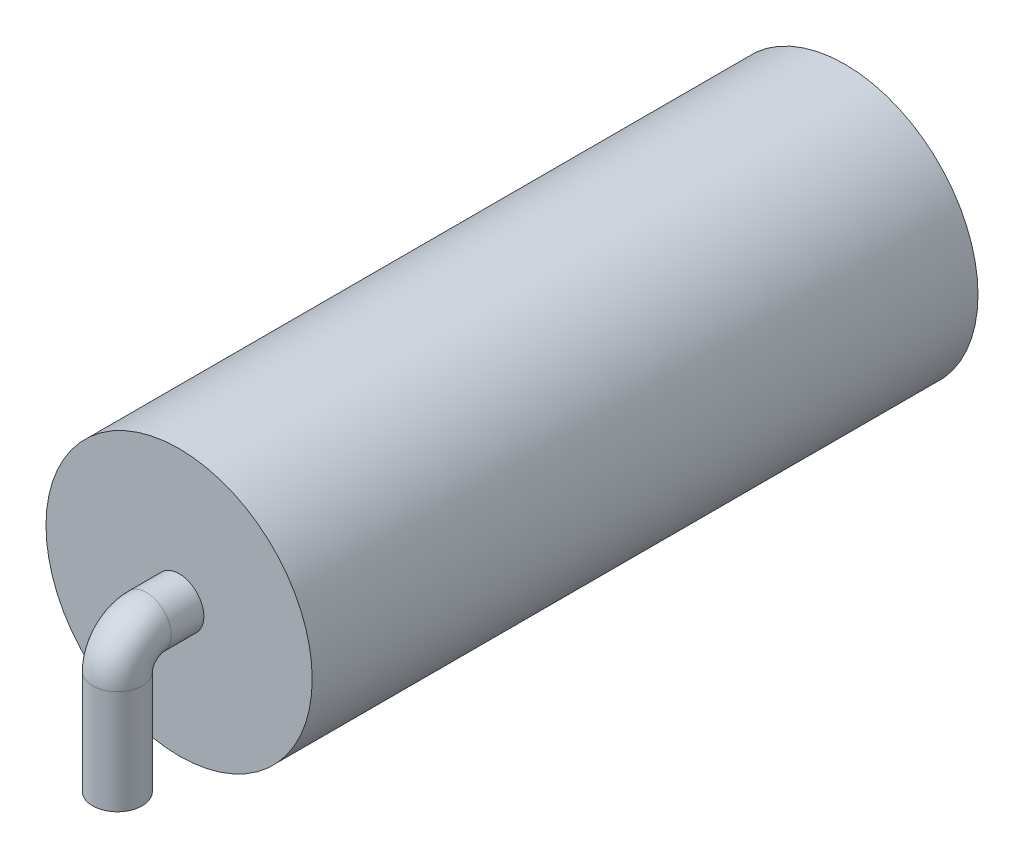
ISO-10303-21;
HEADER;
FILE_DESCRIPTION(('STEP AP214'),'2;1');
FILE_NAME('part.step','',(''),(''),'','','');
FILE_SCHEMA(('AUTOMOTIVE_DESIGN { 1 0 10303 214 1 1 1 1 }'));
ENDSEC;
DATA;
#1=APPLICATION_CONTEXT('core data for automotive mechanical design processes');
#2=APPLICATION_PROTOCOL_DEFINITION('international standard','automotive_design',2000,#1);
#3=PRODUCT_CONTEXT('',#1,'mechanical');
#4=PRODUCT('Part','Part','',(#3));
#5=PRODUCT_RELATED_PRODUCT_CATEGORY('part','',(#4));
#6=PRODUCT_DEFINITION_FORMATION('','',#4);
#7=PRODUCT_DEFINITION_CONTEXT('part definition',#1,'design');
#8=PRODUCT_DEFINITION('design','',#6,#7);
#9=PRODUCT_DEFINITION_SHAPE('','',#8);
#10=(LENGTH_UNIT() NAMED_UNIT(*) SI_UNIT(.MILLI.,.METRE.));
#11=(NAMED_UNIT(*) PLANE_ANGLE_UNIT() SI_UNIT($,.RADIAN.));
#12=(NAMED_UNIT(*) SI_UNIT($,.STERADIAN.) SOLID_ANGLE_UNIT());
#13=UNCERTAINTY_MEASURE_WITH_UNIT(LENGTH_MEASURE(1.E-05),#10,'distance_accuracy_value','');
#14=(GEOMETRIC_REPRESENTATION_CONTEXT(3) GLOBAL_UNCERTAINTY_ASSIGNED_CONTEXT((#13)) GLOBAL_UNIT_ASSIGNED_CONTEXT((#10,
#11,#12)) REPRESENTATION_CONTEXT('',''));
#15=CARTESIAN_POINT('',(0.,0.,0.));
#16=DIRECTION('',(0.,0.,1.));
#17=DIRECTION('',(1.,0.,0.));
#18=AXIS2_PLACEMENT_3D('',#15,#16,#17);
#19=CARTESIAN_POINT('',(0.,0.,5.715));
#20=DIRECTION('',(0.,0.,-1.));
#21=DIRECTION('',(-1.,0.,0.));
#22=AXIS2_PLACEMENT_3D('',#19,#20,#21);
#23=CYLINDRICAL_SURFACE('',#22,2.285);
#24=CARTESIAN_POINT('',(0.,0.,5.715));
#25=DIRECTION('',(0.,0.,1.));
#26=DIRECTION('',(1.,0.,0.));
#27=AXIS2_PLACEMENT_3D('',#24,#25,#26);
#28=CIRCLE('',#27,2.285);
#29=CARTESIAN_POINT('',(2.285,0.,5.715));
#30=VERTEX_POINT('',#29);
#31=EDGE_CURVE('E55',#30,#30,#28,.T.);
#32=ORIENTED_EDGE('',*,*,#31,.F.);
#33=EDGE_LOOP('',(#32));
#34=FACE_BOUND('',#33,.T.);
#35=CARTESIAN_POINT('',(0.,0.,-5.715));
#36=DIRECTION('',(0.,0.,1.));
#37=DIRECTION('',(1.,0.,0.));
#38=AXIS2_PLACEMENT_3D('',#35,#36,#37);
#39=CIRCLE('',#38,2.285);
#40=CARTESIAN_POINT('',(2.285,0.,-5.715));
#41=VERTEX_POINT('',#40);
#42=EDGE_CURVE('E59',#41,#41,#39,.T.);
#43=ORIENTED_EDGE('',*,*,#42,.T.);
#44=EDGE_LOOP('',(#43));
#45=FACE_BOUND('',#44,.T.);
#46=ADVANCED_FACE('F49',(#34,#45),#23,.T.);
#47=CARTESIAN_POINT('',(0.,0.,5.715));
#48=DIRECTION('',(0.,0.,1.));
#49=DIRECTION('',(1.,0.,0.));
#50=AXIS2_PLACEMENT_3D('',#47,#48,#49);
#51=PLANE('',#50);
#52=CARTESIAN_POINT('',(0.,0.,5.715));
#53=DIRECTION('',(0.,0.,1.));
#54=DIRECTION('',(1.,0.,0.));
#55=AXIS2_PLACEMENT_3D('',#52,#53,#54);
#56=CIRCLE('',#55,0.425);
#57=CARTESIAN_POINT('',(0.425,0.,5.715));
#58=VERTEX_POINT('',#57);
#59=EDGE_CURVE('E64',#58,#58,#56,.F.);
#60=ORIENTED_EDGE('',*,*,#59,.T.);
#61=EDGE_LOOP('',(#60));
#62=FACE_BOUND('',#61,.T.);
#63=ORIENTED_EDGE('',*,*,#31,.T.);
#64=EDGE_LOOP('',(#63));
#65=FACE_BOUND('',#64,.T.);
#66=ADVANCED_FACE('F104',(#62,#65),#51,.T.);
#67=CARTESIAN_POINT('',(0.,0.,-5.715));
#68=DIRECTION('',(0.,0.,1.));
#69=DIRECTION('',(1.,0.,0.));
#70=AXIS2_PLACEMENT_3D('',#67,#68,#69);
#71=PLANE('',#70);
#72=CARTESIAN_POINT('',(0.,0.,-5.715));
#73=DIRECTION('',(0.,0.,1.));
#74=DIRECTION('',(1.,0.,0.));
#75=AXIS2_PLACEMENT_3D('',#72,#73,#74);
#76=CIRCLE('',#75,0.425);
#77=CARTESIAN_POINT('',(0.425,0.,-5.715));
#78=VERTEX_POINT('',#77);
#79=EDGE_CURVE('E11',#78,#78,#76,.F.);
#80=ORIENTED_EDGE('',*,*,#79,.F.);
#81=EDGE_LOOP('',(#80));
#82=FACE_BOUND('',#81,.T.);
#83=ORIENTED_EDGE('',*,*,#42,.F.);
#84=EDGE_LOOP('',(#83));
#85=FACE_BOUND('',#84,.T.);
#86=ADVANCED_FACE('F109',(#82,#85),#71,.F.);
#87=CARTESIAN_POINT('',(0.,-2.285,-6.775));
#88=DIRECTION('',(0.,1.,0.));
#89=DIRECTION('',(0.,0.,1.));
#90=AXIS2_PLACEMENT_3D('',#87,#88,#89);
#91=PLANE('',#90);
#92=CARTESIAN_POINT('',(0.,-2.285,-6.775));
#93=DIRECTION('',(0.,1.,0.));
#94=DIRECTION('',(0.,0.,1.));
#95=AXIS2_PLACEMENT_3D('',#92,#93,#94);
#96=CIRCLE('',#95,0.425);
#97=CARTESIAN_POINT('',(0.,-2.285,-6.35));
#98=VERTEX_POINT('',#97);
#99=EDGE_CURVE('E68',#98,#98,#96,.T.);
#100=ORIENTED_EDGE('',*,*,#99,.F.);
#101=EDGE_LOOP('',(#100));
#102=FACE_BOUND('',#101,.T.);
#103=ADVANCED_FACE('F116',(#102),#91,.F.);
#104=CARTESIAN_POINT('',(0.,-0.500000000000001,-6.775));
#105=DIRECTION('',(0.,-1.,0.));
#106=DIRECTION('',(0.,0.,-1.));
#107=AXIS2_PLACEMENT_3D('',#104,#105,#106);
#108=CYLINDRICAL_SURFACE('',#107,0.425);
#109=ORIENTED_EDGE('',*,*,#99,.T.);
#110=EDGE_LOOP('',(#109));
#111=FACE_BOUND('',#110,.T.);
#112=CARTESIAN_POINT('',(0.,-0.499999999999999,-6.775));
#113=DIRECTION('',(0.,1.,0.));
#114=DIRECTION('',(0.,0.,1.));
#115=AXIS2_PLACEMENT_3D('',#112,#113,#114);
#116=CIRCLE('',#115,0.425);
#117=CARTESIAN_POINT('',(0.,-0.499999999999997,-7.2));
#118=VERTEX_POINT('',#117);
#119=EDGE_CURVE('E71',#118,#118,#116,.T.);
#120=ORIENTED_EDGE('',*,*,#119,.F.);
#121=EDGE_LOOP('',(#120));
#122=FACE_BOUND('',#121,.T.);
#123=ADVANCED_FACE('F121',(#111,#122),#108,.T.);
#124=CARTESIAN_POINT('',(0.,-0.500000000000001,-6.275));
#125=DIRECTION('',(-1.,0.,0.));
#126=DIRECTION('',(0.,0.,1.));
#127=AXIS2_PLACEMENT_3D('',#124,#125,#126);
#128=TOROIDAL_SURFACE('',#127,0.499999999999999,0.425);
#129=CARTESIAN_POINT('',(0.,0.,-6.275));
#130=DIRECTION('',(0.,0.,1.));
#131=DIRECTION('',(0.,-1.,0.));
#132=AXIS2_PLACEMENT_3D('',#129,#130,#131);
#133=CIRCLE('',#132,0.425);
#134=CARTESIAN_POINT('',(0.,0.424999999999998,-6.275));
#135=VERTEX_POINT('',#134);
#136=EDGE_CURVE('E74',#135,#135,#133,.T.);
#137=CARTESIAN_POINT('',(0.,-0.500000000000001,-6.275));
#138=DIRECTION('',(-1.,0.,0.));
#139=DIRECTION('',(0.,0.,1.));
#140=AXIS2_PLACEMENT_3D('',#137,#138,#139);
#141=CIRCLE('',#140,0.924999999999999);
#142=EDGE_CURVE('',#135,#118,#141,.T.);
#143=ORIENTED_EDGE('',*,*,#136,.F.);
#144=ORIENTED_EDGE('',*,*,#119,.T.);
#145=ORIENTED_EDGE('',*,*,#142,.T.);
#146=ORIENTED_EDGE('',*,*,#142,.F.);
#147=EDGE_LOOP('',(#143,#145,#144,#146));
#148=FACE_BOUND('',#147,.T.);
#149=ADVANCED_FACE('F127',(#148),#128,.T.);
#150=CARTESIAN_POINT('',(0.,0.,6.275));
#151=DIRECTION('',(0.,0.,-1.));
#152=DIRECTION('',(-1.,0.,0.));
#153=AXIS2_PLACEMENT_3D('',#150,#151,#152);
#154=CYLINDRICAL_SURFACE('',#153,0.425);
#155=ORIENTED_EDGE('',*,*,#136,.T.);
#156=EDGE_LOOP('',(#155));
#157=FACE_BOUND('',#156,.T.);
#158=ORIENTED_EDGE('',*,*,#79,.T.);
#159=EDGE_LOOP('',(#158));
#160=FACE_BOUND('',#159,.T.);
#161=ADVANCED_FACE('F101',(#157,#160),#154,.T.);
#162=CARTESIAN_POINT('',(0.,-2.285,6.775));
#163=DIRECTION('',(0.,-1.,0.));
#164=DIRECTION('',(0.,0.,-1.));
#165=AXIS2_PLACEMENT_3D('',#162,#163,#164);
#166=PLANE('',#165);
#167=CARTESIAN_POINT('',(0.,-2.285,6.775));
#168=DIRECTION('',(0.,-1.,0.));
#169=DIRECTION('',(0.,0.,-1.));
#170=AXIS2_PLACEMENT_3D('',#167,#168,#169);
#171=CIRCLE('',#170,0.425);
#172=CARTESIAN_POINT('',(0.,-2.285,6.35));
#173=VERTEX_POINT('',#172);
#174=EDGE_CURVE('E83',#173,#173,#171,.T.);
#175=ORIENTED_EDGE('',*,*,#174,.T.);
#176=EDGE_LOOP('',(#175));
#177=FACE_BOUND('',#176,.T.);
#178=ADVANCED_FACE('F87',(#177),#166,.T.);
#179=CARTESIAN_POINT('',(0.,-2.285,6.775));
#180=DIRECTION('',(0.,1.,0.));
#181=DIRECTION('',(0.,0.,1.));
#182=AXIS2_PLACEMENT_3D('',#179,#180,#181);
#183=CYLINDRICAL_SURFACE('',#182,0.425);
#184=CARTESIAN_POINT('',(0.,-0.500000000000001,6.775));
#185=DIRECTION('',(0.,-1.,0.));
#186=DIRECTION('',(0.,0.,-1.));
#187=AXIS2_PLACEMENT_3D('',#184,#185,#186);
#188=CIRCLE('',#187,0.425);
#189=CARTESIAN_POINT('',(0.,-0.500000000000002,7.2));
#190=VERTEX_POINT('',#189);
#191=EDGE_CURVE('E80',#190,#190,#188,.T.);
#192=ORIENTED_EDGE('',*,*,#191,.T.);
#193=EDGE_LOOP('',(#192));
#194=FACE_BOUND('',#193,.T.);
#195=ORIENTED_EDGE('',*,*,#174,.F.);
#196=EDGE_LOOP('',(#195));
#197=FACE_BOUND('',#196,.T.);
#198=ADVANCED_FACE('F89',(#194,#197),#183,.T.);
#199=CARTESIAN_POINT('',(0.,-0.500000000000001,6.275));
#200=DIRECTION('',(-1.,0.,0.));
#201=DIRECTION('',(0.,0.,1.));
#202=AXIS2_PLACEMENT_3D('',#199,#200,#201);
#203=TOROIDAL_SURFACE('',#202,0.499999999999999,0.425);
#204=CARTESIAN_POINT('',(0.,0.,6.275));
#205=DIRECTION('',(0.,0.,1.));
#206=DIRECTION('',(0.,-1.,0.));
#207=AXIS2_PLACEMENT_3D('',#204,#205,#206);
#208=CIRCLE('',#207,0.425);
#209=CARTESIAN_POINT('',(0.,0.424999999999998,6.275));
#210=VERTEX_POINT('',#209);
#211=EDGE_CURVE('E77',#210,#210,#208,.T.);
#212=CARTESIAN_POINT('',(0.,-0.500000000000001,6.275));
#213=DIRECTION('',(-1.,0.,0.));
#214=DIRECTION('',(0.,0.,1.));
#215=AXIS2_PLACEMENT_3D('',#212,#213,#214);
#216=CIRCLE('',#215,0.924999999999999);
#217=EDGE_CURVE('',#190,#210,#216,.T.);
#218=ORIENTED_EDGE('',*,*,#191,.F.);
#219=ORIENTED_EDGE('',*,*,#211,.T.);
#220=ORIENTED_EDGE('',*,*,#217,.T.);
#221=ORIENTED_EDGE('',*,*,#217,.F.);
#222=EDGE_LOOP('',(#218,#220,#219,#221));
#223=FACE_BOUND('',#222,.T.);
#224=ADVANCED_FACE('F91',(#223),#203,.T.);
#225=ORIENTED_EDGE('',*,*,#59,.F.);
#226=EDGE_LOOP('',(#225));
#227=FACE_BOUND('',#226,.T.);
#228=ORIENTED_EDGE('',*,*,#211,.F.);
#229=EDGE_LOOP('',(#228));
#230=FACE_BOUND('',#229,.T.);
#231=ADVANCED_FACE('F98',(#227,#230),#154,.T.);
#232=CLOSED_SHELL('',(#46,#66,#86,#103,#123,#149,#161,#178,#198,#224,#231));
#233=MANIFOLD_SOLID_BREP('B2',#232);
#234=ADVANCED_BREP_SHAPE_REPRESENTATION('',(#18,#233),#14);
#235=SHAPE_DEFINITION_REPRESENTATION(#9,#234);
ENDSEC;
END-ISO-10303-21;
